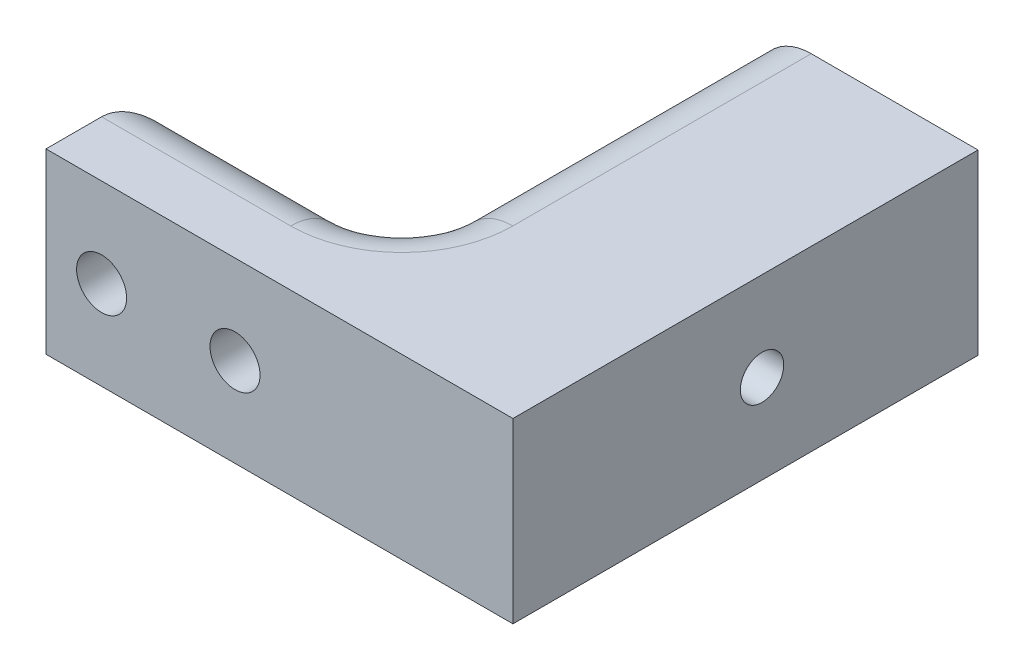
ISO-10303-21;
HEADER;
FILE_DESCRIPTION(('STEP AP214'),'2;1');
FILE_NAME('part.step','',(''),(''),'','','');
FILE_SCHEMA(('AUTOMOTIVE_DESIGN { 1 0 10303 214 1 1 1 1 }'));
ENDSEC;
DATA;
#1=APPLICATION_CONTEXT('core data for automotive mechanical design processes');
#2=APPLICATION_PROTOCOL_DEFINITION('international standard','automotive_design',2000,#1);
#3=PRODUCT_CONTEXT('',#1,'mechanical');
#4=PRODUCT('Part','Part','',(#3));
#5=PRODUCT_RELATED_PRODUCT_CATEGORY('part','',(#4));
#6=PRODUCT_DEFINITION_FORMATION('','',#4);
#7=PRODUCT_DEFINITION_CONTEXT('part definition',#1,'design');
#8=PRODUCT_DEFINITION('design','',#6,#7);
#9=PRODUCT_DEFINITION_SHAPE('','',#8);
#10=(LENGTH_UNIT() NAMED_UNIT(*) SI_UNIT(.MILLI.,.METRE.));
#11=(NAMED_UNIT(*) PLANE_ANGLE_UNIT() SI_UNIT($,.RADIAN.));
#12=(NAMED_UNIT(*) SI_UNIT($,.STERADIAN.) SOLID_ANGLE_UNIT());
#13=UNCERTAINTY_MEASURE_WITH_UNIT(LENGTH_MEASURE(1.E-05),#10,'distance_accuracy_value','');
#14=(GEOMETRIC_REPRESENTATION_CONTEXT(3) GLOBAL_UNCERTAINTY_ASSIGNED_CONTEXT((#13)) GLOBAL_UNIT_ASSIGNED_CONTEXT((#10,
#11,#12)) REPRESENTATION_CONTEXT('',''));
#15=CARTESIAN_POINT('',(0.,0.,0.));
#16=DIRECTION('',(0.,0.,1.));
#17=DIRECTION('',(1.,0.,0.));
#18=AXIS2_PLACEMENT_3D('',#15,#16,#17);
#19=CARTESIAN_POINT('',(0.999999999999994,8.,0.));
#20=DIRECTION('',(1.,0.,0.));
#21=DIRECTION('',(0.,0.,-1.));
#22=AXIS2_PLACEMENT_3D('',#19,#20,#21);
#23=PLANE('',#22);
#24=DIRECTION('',(0.,-0.866025403784438,0.5));
#25=VECTOR('',#24,1.);
#26=CARTESIAN_POINT('',(0.999999999999994,4.05,21.763268590218));
#27=LINE('',#26,#25);
#28=CARTESIAN_POINT('',(0.999999999999994,3.,22.3694863728671));
#29=VERTEX_POINT('',#28);
#30=CARTESIAN_POINT('',(0.999999999999994,0.,24.101537180436));
#31=VERTEX_POINT('',#30);
#32=EDGE_CURVE('E439',#29,#31,#27,.T.);
#33=ORIENTED_EDGE('',*,*,#32,.T.);
#34=DIRECTION('',(0.,-0.866025403784439,-0.5));
#35=VECTOR('',#34,1.);
#36=CARTESIAN_POINT('',(0.999999999999994,0.,24.101537180436));
#37=LINE('',#36,#35);
#38=CARTESIAN_POINT('',(0.999999999999994,-3.,22.3694863728671));
#39=VERTEX_POINT('',#38);
#40=EDGE_CURVE('E204',#31,#39,#37,.T.);
#41=ORIENTED_EDGE('',*,*,#40,.T.);
#42=DIRECTION('',(0.,0.,1.));
#43=VECTOR('',#42,1.);
#44=CARTESIAN_POINT('',(0.999999999999994,-3.,0.));
#45=LINE('',#44,#43);
#46=CARTESIAN_POINT('',(0.999999999999994,-3.,26.83));
#47=VERTEX_POINT('',#46);
#48=EDGE_CURVE('E270',#39,#47,#45,.T.);
#49=ORIENTED_EDGE('',*,*,#48,.T.);
#50=DIRECTION('',(0.,-1.,0.));
#51=VECTOR('',#50,1.);
#52=CARTESIAN_POINT('',(0.999999999999994,8.,26.83));
#53=LINE('',#52,#51);
#54=CARTESIAN_POINT('',(0.999999999999994,3.,26.83));
#55=VERTEX_POINT('',#54);
#56=EDGE_CURVE('E268',#47,#55,#53,.F.);
#57=ORIENTED_EDGE('',*,*,#56,.T.);
#58=DIRECTION('',(0.,0.,1.));
#59=VECTOR('',#58,1.);
#60=CARTESIAN_POINT('',(0.999999999999994,3.,0.));
#61=LINE('',#60,#59);
#62=EDGE_CURVE('E275',#55,#29,#61,.F.);
#63=ORIENTED_EDGE('',*,*,#62,.T.);
#64=EDGE_LOOP('',(#33,#41,#49,#57,#63));
#65=FACE_BOUND('',#64,.T.);
#66=ADVANCED_FACE('F39',(#65),#23,.F.);
#67=DIRECTION('',(0.,0.866025403784439,-0.5));
#68=VECTOR('',#67,1.);
#69=CARTESIAN_POINT('',(0.999999999999994,-4.05,17.086731409782));
#70=LINE('',#69,#68);
#71=CARTESIAN_POINT('',(0.999999999999994,-3.,16.4805136271329));
#72=VERTEX_POINT('',#71);
#73=CARTESIAN_POINT('',(0.999999999999994,0.,14.748462819564));
#74=VERTEX_POINT('',#73);
#75=EDGE_CURVE('E493',#72,#74,#70,.T.);
#76=ORIENTED_EDGE('',*,*,#75,.T.);
#77=DIRECTION('',(0.,0.866025403784439,0.499999999999999));
#78=VECTOR('',#77,1.);
#79=CARTESIAN_POINT('',(0.999999999999994,0.,14.748462819564));
#80=LINE('',#79,#78);
#81=CARTESIAN_POINT('',(0.999999999999994,3.,16.4805136271329));
#82=VERTEX_POINT('',#81);
#83=EDGE_CURVE('E200',#74,#82,#80,.T.);
#84=ORIENTED_EDGE('',*,*,#83,.T.);
#85=CARTESIAN_POINT('',(0.999999999999994,3.,0.));
#86=VERTEX_POINT('',#85);
#87=EDGE_CURVE('E274',#82,#86,#61,.F.);
#88=ORIENTED_EDGE('',*,*,#87,.T.);
#89=DIRECTION('',(0.,-1.,0.));
#90=VECTOR('',#89,1.);
#91=CARTESIAN_POINT('',(0.999999999999994,8.,0.));
#92=LINE('',#91,#90);
#93=CARTESIAN_POINT('',(0.999999999999994,-3.,0.));
#94=VERTEX_POINT('',#93);
#95=EDGE_CURVE('E228',#86,#94,#92,.T.);
#96=ORIENTED_EDGE('',*,*,#95,.T.);
#97=EDGE_CURVE('E271',#94,#72,#45,.T.);
#98=ORIENTED_EDGE('',*,*,#97,.T.);
#99=EDGE_LOOP('',(#76,#84,#88,#96,#98));
#100=FACE_BOUND('',#99,.T.);
#101=ADVANCED_FACE('F364',(#100),#23,.F.);
#102=CARTESIAN_POINT('',(5.99999999999999,-3.,0.));
#103=DIRECTION('',(0.,0.,1.));
#104=DIRECTION('',(1.,0.,0.));
#105=AXIS2_PLACEMENT_3D('',#102,#103,#104);
#106=CYLINDRICAL_SURFACE('',#105,5.);
#107=ORIENTED_EDGE('',*,*,#48,.F.);
#108=CARTESIAN_POINT('',(5.99999999999999,-3.,22.3694863728671));
#109=DIRECTION('',(0.,0.5,-0.866025403784439));
#110=DIRECTION('',(0.,0.866025403784439,0.5));
#111=AXIS2_PLACEMENT_3D('',#108,#109,#110);
#112=ELLIPSE('',#111,5.77350269189626,5.);
#113=CARTESIAN_POINT('',(1.11149307047642,-4.05,21.763268590218));
#114=VERTEX_POINT('',#113);
#115=EDGE_CURVE('E11',#39,#114,#112,.F.);
#116=ORIENTED_EDGE('',*,*,#115,.T.);
#117=DIRECTION('',(0.,0.,1.));
#118=VECTOR('',#117,1.);
#119=CARTESIAN_POINT('',(1.11149307047642,-4.05000000000001,0.));
#120=LINE('',#119,#118);
#121=CARTESIAN_POINT('',(1.11149307047642,-4.05,17.086731409782));
#122=VERTEX_POINT('',#121);
#123=EDGE_CURVE('E47',#114,#122,#120,.F.);
#124=ORIENTED_EDGE('',*,*,#123,.T.);
#125=CARTESIAN_POINT('',(5.99999999999999,-3.,16.4805136271329));
#126=DIRECTION('',(0.,0.5,0.866025403784439));
#127=DIRECTION('',(0.,-0.866025403784439,0.5));
#128=AXIS2_PLACEMENT_3D('',#125,#126,#127);
#129=ELLIPSE('',#128,5.77350269189626,5.);
#130=EDGE_CURVE('E457',#122,#72,#129,.F.);
#131=ORIENTED_EDGE('',*,*,#130,.T.);
#132=ORIENTED_EDGE('',*,*,#97,.F.);
#133=CARTESIAN_POINT('',(5.99999999999999,-3.,0.));
#134=DIRECTION('',(0.,0.,1.));
#135=DIRECTION('',(1.,0.,0.));
#136=AXIS2_PLACEMENT_3D('',#133,#134,#135);
#137=CIRCLE('',#136,5.);
#138=CARTESIAN_POINT('',(5.99999999999999,-8.,0.));
#139=VERTEX_POINT('',#138);
#140=EDGE_CURVE('E278',#139,#94,#137,.F.);
#141=ORIENTED_EDGE('',*,*,#140,.F.);
#142=DIRECTION('',(0.,0.,1.));
#143=VECTOR('',#142,1.);
#144=CARTESIAN_POINT('',(5.99999999999999,-8.,41.83));
#145=LINE('',#144,#143);
#146=CARTESIAN_POINT('',(5.99999999999999,-8.,26.83));
#147=VERTEX_POINT('',#146);
#148=EDGE_CURVE('E287',#147,#139,#145,.F.);
#149=ORIENTED_EDGE('',*,*,#148,.F.);
#150=CARTESIAN_POINT('',(5.99999999999999,-3.,26.83));
#151=DIRECTION('',(0.,0.,1.));
#152=DIRECTION('',(1.,0.,0.));
#153=AXIS2_PLACEMENT_3D('',#150,#151,#152);
#154=CIRCLE('',#153,5.);
#155=EDGE_CURVE('E317',#47,#147,#154,.T.);
#156=ORIENTED_EDGE('',*,*,#155,.F.);
#157=EDGE_LOOP('',(#107,#116,#124,#131,#132,#141,#149,#156));
#158=FACE_BOUND('',#157,.T.);
#159=ADVANCED_FACE('F391',(#158),#106,.T.);
#160=CARTESIAN_POINT('',(5.99999999999999,3.,41.83));
#161=DIRECTION('',(0.,0.,1.));
#162=DIRECTION('',(1.,0.,0.));
#163=AXIS2_PLACEMENT_3D('',#160,#161,#162);
#164=CYLINDRICAL_SURFACE('',#163,5.);
#165=DIRECTION('',(0.,0.,1.));
#166=VECTOR('',#165,1.);
#167=CARTESIAN_POINT('',(1.11149307047642,4.05,41.83));
#168=LINE('',#167,#166);
#169=CARTESIAN_POINT('',(1.11149307047642,4.05,17.086731409782));
#170=VERTEX_POINT('',#169);
#171=CARTESIAN_POINT('',(1.11149307047642,4.05,21.763268590218));
#172=VERTEX_POINT('',#171);
#173=EDGE_CURVE('E445',#170,#172,#168,.T.);
#174=ORIENTED_EDGE('',*,*,#173,.T.);
#175=CARTESIAN_POINT('',(5.99999999999999,3.,22.3694863728671));
#176=DIRECTION('',(0.,-0.5,-0.866025403784439));
#177=DIRECTION('',(0.,-0.866025403784438,0.5));
#178=AXIS2_PLACEMENT_3D('',#175,#176,#177);
#179=ELLIPSE('',#178,5.77350269189626,5.);
#180=EDGE_CURVE('E438',#172,#29,#179,.F.);
#181=ORIENTED_EDGE('',*,*,#180,.T.);
#182=ORIENTED_EDGE('',*,*,#62,.F.);
#183=CARTESIAN_POINT('',(5.99999999999999,3.,26.83));
#184=DIRECTION('',(0.,0.,1.));
#185=DIRECTION('',(1.,0.,0.));
#186=AXIS2_PLACEMENT_3D('',#183,#184,#185);
#187=CIRCLE('',#186,5.);
#188=CARTESIAN_POINT('',(5.99999999999999,8.,26.83));
#189=VERTEX_POINT('',#188);
#190=EDGE_CURVE('E227',#55,#189,#187,.F.);
#191=ORIENTED_EDGE('',*,*,#190,.T.);
#192=DIRECTION('',(0.,0.,1.));
#193=VECTOR('',#192,1.);
#194=CARTESIAN_POINT('',(5.99999999999999,8.,41.83));
#195=LINE('',#194,#193);
#196=CARTESIAN_POINT('',(5.99999999999999,8.,0.));
#197=VERTEX_POINT('',#196);
#198=EDGE_CURVE('E265',#197,#189,#195,.T.);
#199=ORIENTED_EDGE('',*,*,#198,.F.);
#200=CARTESIAN_POINT('',(5.99999999999999,3.,0.));
#201=DIRECTION('',(0.,0.,1.));
#202=DIRECTION('',(1.,0.,0.));
#203=AXIS2_PLACEMENT_3D('',#200,#201,#202);
#204=CIRCLE('',#203,5.);
#205=EDGE_CURVE('E280',#86,#197,#204,.F.);
#206=ORIENTED_EDGE('',*,*,#205,.F.);
#207=ORIENTED_EDGE('',*,*,#87,.F.);
#208=CARTESIAN_POINT('',(5.99999999999999,3.,16.4805136271329));
#209=DIRECTION('',(0.,-0.5,0.866025403784439));
#210=DIRECTION('',(0.,0.866025403784439,0.499999999999999));
#211=AXIS2_PLACEMENT_3D('',#208,#209,#210);
#212=ELLIPSE('',#211,5.77350269189625,5.);
#213=EDGE_CURVE('E462',#82,#170,#212,.F.);
#214=ORIENTED_EDGE('',*,*,#213,.T.);
#215=EDGE_LOOP('',(#174,#181,#182,#191,#199,#206,#207,#214));
#216=FACE_BOUND('',#215,.T.);
#217=ADVANCED_FACE('F388',(#216),#164,.T.);
#218=CARTESIAN_POINT('',(-21.,8.,41.83));
#219=DIRECTION('',(1.,0.,0.));
#220=DIRECTION('',(0.,1.,0.));
#221=AXIS2_PLACEMENT_3D('',#218,#219,#220);
#222=PLANE('',#221);
#223=DIRECTION('',(0.,0.,-1.));
#224=VECTOR('',#223,1.);
#225=CARTESIAN_POINT('',(-21.,8.,41.83));
#226=LINE('',#225,#224);
#227=CARTESIAN_POINT('',(-21.,8.,41.83));
#228=VERTEX_POINT('',#227);
#229=CARTESIAN_POINT('',(-21.,8.,36.83));
#230=VERTEX_POINT('',#229);
#231=EDGE_CURVE('E243',#228,#230,#226,.T.);
#232=ORIENTED_EDGE('',*,*,#231,.T.);
#233=DIRECTION('',(0.,-1.,0.));
#234=VECTOR('',#233,1.);
#235=CARTESIAN_POINT('',(-21.,8.,36.83));
#236=LINE('',#235,#234);
#237=CARTESIAN_POINT('',(-21.,-8.,36.83));
#238=VERTEX_POINT('',#237);
#239=EDGE_CURVE('E301',#230,#238,#236,.T.);
#240=ORIENTED_EDGE('',*,*,#239,.T.);
#241=DIRECTION('',(0.,0.,-1.));
#242=VECTOR('',#241,1.);
#243=CARTESIAN_POINT('',(-21.,-8.,41.83));
#244=LINE('',#243,#242);
#245=CARTESIAN_POINT('',(-21.,-8.,41.83));
#246=VERTEX_POINT('',#245);
#247=EDGE_CURVE('E257',#246,#238,#244,.T.);
#248=ORIENTED_EDGE('',*,*,#247,.F.);
#249=DIRECTION('',(0.,-1.,0.));
#250=VECTOR('',#249,1.);
#251=CARTESIAN_POINT('',(-21.,8.,41.83));
#252=LINE('',#251,#250);
#253=EDGE_CURVE('E233',#228,#246,#252,.T.);
#254=ORIENTED_EDGE('',*,*,#253,.F.);
#255=EDGE_LOOP('',(#232,#240,#248,#254));
#256=FACE_BOUND('',#255,.T.);
#257=ADVANCED_FACE('F384',(#256),#222,.F.);
#258=CARTESIAN_POINT('',(-21.,-8.,41.83));
#259=DIRECTION('',(0.,1.,0.));
#260=DIRECTION('',(0.,0.,1.));
#261=AXIS2_PLACEMENT_3D('',#258,#259,#260);
#262=PLANE('',#261);
#263=CARTESIAN_POINT('',(-4.00000000000001,-8.,26.83));
#264=DIRECTION('',(0.,1.,0.));
#265=DIRECTION('',(0.,0.,1.));
#266=AXIS2_PLACEMENT_3D('',#263,#264,#265);
#267=CIRCLE('',#266,10.);
#268=CARTESIAN_POINT('',(-4.00000000000001,-8.,36.83));
#269=VERTEX_POINT('',#268);
#270=EDGE_CURVE('E282',#147,#269,#267,.F.);
#271=ORIENTED_EDGE('',*,*,#270,.F.);
#272=ORIENTED_EDGE('',*,*,#148,.T.);
#273=DIRECTION('',(1.,0.,0.));
#274=VECTOR('',#273,1.);
#275=CARTESIAN_POINT('',(-21.,-8.,0.));
#276=LINE('',#275,#274);
#277=CARTESIAN_POINT('',(21.,-8.,0.));
#278=VERTEX_POINT('',#277);
#279=EDGE_CURVE('E231',#139,#278,#276,.T.);
#280=ORIENTED_EDGE('',*,*,#279,.T.);
#281=DIRECTION('',(0.,0.,-1.));
#282=VECTOR('',#281,1.);
#283=CARTESIAN_POINT('',(21.,-8.,41.83));
#284=LINE('',#283,#282);
#285=CARTESIAN_POINT('',(21.,-8.,41.83));
#286=VERTEX_POINT('',#285);
#287=EDGE_CURVE('E254',#286,#278,#284,.T.);
#288=ORIENTED_EDGE('',*,*,#287,.F.);
#289=DIRECTION('',(1.,0.,0.));
#290=VECTOR('',#289,1.);
#291=CARTESIAN_POINT('',(-21.,-8.,41.83));
#292=LINE('',#291,#290);
#293=EDGE_CURVE('E236',#246,#286,#292,.T.);
#294=ORIENTED_EDGE('',*,*,#293,.F.);
#295=ORIENTED_EDGE('',*,*,#247,.T.);
#296=DIRECTION('',(-1.,0.,0.));
#297=VECTOR('',#296,1.);
#298=CARTESIAN_POINT('',(-21.,-8.,36.83));
#299=LINE('',#298,#297);
#300=EDGE_CURVE('E285',#238,#269,#299,.F.);
#301=ORIENTED_EDGE('',*,*,#300,.T.);
#302=EDGE_LOOP('',(#271,#272,#280,#288,#294,#295,#301));
#303=FACE_BOUND('',#302,.T.);
#304=ADVANCED_FACE('F380',(#303),#262,.F.);
#305=CARTESIAN_POINT('',(21.,8.,41.83));
#306=DIRECTION('',(-1.,0.,0.));
#307=DIRECTION('',(0.,-1.,0.));
#308=AXIS2_PLACEMENT_3D('',#305,#306,#307);
#309=PLANE('',#308);
#310=CARTESIAN_POINT('',(21.,0.,19.425));
#311=DIRECTION('',(1.,0.,0.));
#312=DIRECTION('',(0.,0.,-1.));
#313=AXIS2_PLACEMENT_3D('',#310,#311,#312);
#314=CIRCLE('',#313,1.94999999999999);
#315=CARTESIAN_POINT('',(21.,0.,17.475));
#316=VERTEX_POINT('',#315);
#317=EDGE_CURVE('E224',#316,#316,#314,.T.);
#318=ORIENTED_EDGE('',*,*,#317,.F.);
#319=EDGE_LOOP('',(#318));
#320=FACE_BOUND('',#319,.T.);
#321=DIRECTION('',(0.,1.,0.));
#322=VECTOR('',#321,1.);
#323=CARTESIAN_POINT('',(21.,8.,0.));
#324=LINE('',#323,#322);
#325=CARTESIAN_POINT('',(21.,8.,0.));
#326=VERTEX_POINT('',#325);
#327=EDGE_CURVE('E245',#278,#326,#324,.T.);
#328=ORIENTED_EDGE('',*,*,#327,.T.);
#329=DIRECTION('',(0.,0.,-1.));
#330=VECTOR('',#329,1.);
#331=CARTESIAN_POINT('',(21.,8.,41.83));
#332=LINE('',#331,#330);
#333=CARTESIAN_POINT('',(21.,8.,41.83));
#334=VERTEX_POINT('',#333);
#335=EDGE_CURVE('E251',#334,#326,#332,.T.);
#336=ORIENTED_EDGE('',*,*,#335,.F.);
#337=DIRECTION('',(0.,1.,0.));
#338=VECTOR('',#337,1.);
#339=CARTESIAN_POINT('',(21.,8.,41.83));
#340=LINE('',#339,#338);
#341=EDGE_CURVE('E239',#286,#334,#340,.T.);
#342=ORIENTED_EDGE('',*,*,#341,.F.);
#343=ORIENTED_EDGE('',*,*,#287,.T.);
#344=EDGE_LOOP('',(#328,#336,#342,#343));
#345=FACE_BOUND('',#344,.T.);
#346=ADVANCED_FACE('F376',(#320,#345),#309,.F.);
#347=CARTESIAN_POINT('',(-21.,8.,41.83));
#348=DIRECTION('',(0.,-1.,0.));
#349=DIRECTION('',(0.,0.,-1.));
#350=AXIS2_PLACEMENT_3D('',#347,#348,#349);
#351=PLANE('',#350);
#352=DIRECTION('',(-1.,0.,0.));
#353=VECTOR('',#352,1.);
#354=CARTESIAN_POINT('',(-21.,8.,0.));
#355=LINE('',#354,#353);
#356=EDGE_CURVE('E237',#326,#197,#355,.T.);
#357=ORIENTED_EDGE('',*,*,#356,.T.);
#358=ORIENTED_EDGE('',*,*,#198,.T.);
#359=CARTESIAN_POINT('',(-4.00000000000001,8.,26.83));
#360=DIRECTION('',(0.,-1.,0.));
#361=DIRECTION('',(0.,0.,-1.));
#362=AXIS2_PLACEMENT_3D('',#359,#360,#361);
#363=CIRCLE('',#362,10.);
#364=CARTESIAN_POINT('',(-4.00000000000001,8.,36.83));
#365=VERTEX_POINT('',#364);
#366=EDGE_CURVE('E262',#365,#189,#363,.F.);
#367=ORIENTED_EDGE('',*,*,#366,.F.);
#368=DIRECTION('',(-1.,0.,0.));
#369=VECTOR('',#368,1.);
#370=CARTESIAN_POINT('',(-21.,8.,36.83));
#371=LINE('',#370,#369);
#372=EDGE_CURVE('E260',#365,#230,#371,.T.);
#373=ORIENTED_EDGE('',*,*,#372,.T.);
#374=ORIENTED_EDGE('',*,*,#231,.F.);
#375=DIRECTION('',(-1.,0.,0.));
#376=VECTOR('',#375,1.);
#377=CARTESIAN_POINT('',(-21.,8.,41.83));
#378=LINE('',#377,#376);
#379=EDGE_CURVE('E241',#334,#228,#378,.T.);
#380=ORIENTED_EDGE('',*,*,#379,.F.);
#381=ORIENTED_EDGE('',*,*,#335,.T.);
#382=EDGE_LOOP('',(#357,#358,#367,#373,#374,#380,#381));
#383=FACE_BOUND('',#382,.T.);
#384=ADVANCED_FACE('F369',(#383),#351,.F.);
#385=CARTESIAN_POINT('',(0.,0.,41.83));
#386=DIRECTION('',(0.,0.,1.));
#387=DIRECTION('',(1.,0.,0.));
#388=AXIS2_PLACEMENT_3D('',#385,#386,#387);
#389=PLANE('',#388);
#390=CARTESIAN_POINT('',(-16.,0.,41.83));
#391=DIRECTION('',(0.,0.,1.));
#392=DIRECTION('',(1.,0.,0.));
#393=AXIS2_PLACEMENT_3D('',#390,#391,#392);
#394=CIRCLE('',#393,2.24999999999999);
#395=CARTESIAN_POINT('',(-13.75,0.,41.83));
#396=VERTEX_POINT('',#395);
#397=EDGE_CURVE('E209',#396,#396,#394,.T.);
#398=ORIENTED_EDGE('',*,*,#397,.F.);
#399=EDGE_LOOP('',(#398));
#400=FACE_BOUND('',#399,.T.);
#401=CARTESIAN_POINT('',(-4.00000000000001,0.,41.83));
#402=DIRECTION('',(0.,0.,1.));
#403=DIRECTION('',(1.,0.,0.));
#404=AXIS2_PLACEMENT_3D('',#401,#402,#403);
#405=CIRCLE('',#404,2.24999999999999);
#406=CARTESIAN_POINT('',(-1.75000000000002,0.,41.83));
#407=VERTEX_POINT('',#406);
#408=EDGE_CURVE('E218',#407,#407,#405,.T.);
#409=ORIENTED_EDGE('',*,*,#408,.F.);
#410=EDGE_LOOP('',(#409));
#411=FACE_BOUND('',#410,.T.);
#412=ORIENTED_EDGE('',*,*,#253,.T.);
#413=ORIENTED_EDGE('',*,*,#293,.T.);
#414=ORIENTED_EDGE('',*,*,#341,.T.);
#415=ORIENTED_EDGE('',*,*,#379,.T.);
#416=EDGE_LOOP('',(#412,#413,#414,#415));
#417=FACE_BOUND('',#416,.T.);
#418=ADVANCED_FACE('F366',(#400,#411,#417),#389,.T.);
#419=CARTESIAN_POINT('',(0.,0.,0.));
#420=DIRECTION('',(0.,0.,1.));
#421=DIRECTION('',(1.,0.,0.));
#422=AXIS2_PLACEMENT_3D('',#419,#420,#421);
#423=PLANE('',#422);
#424=ORIENTED_EDGE('',*,*,#95,.F.);
#425=ORIENTED_EDGE('',*,*,#205,.T.);
#426=ORIENTED_EDGE('',*,*,#356,.F.);
#427=ORIENTED_EDGE('',*,*,#327,.F.);
#428=ORIENTED_EDGE('',*,*,#279,.F.);
#429=ORIENTED_EDGE('',*,*,#140,.T.);
#430=EDGE_LOOP('',(#424,#425,#426,#427,#428,#429));
#431=FACE_BOUND('',#430,.T.);
#432=ADVANCED_FACE('F360',(#431),#423,.F.);
#433=CARTESIAN_POINT('',(-21.,8.,31.83));
#434=DIRECTION('',(0.,0.,1.));
#435=DIRECTION('',(1.,0.,0.));
#436=AXIS2_PLACEMENT_3D('',#433,#434,#435);
#437=PLANE('',#436);
#438=DIRECTION('',(0.,-1.,0.));
#439=VECTOR('',#438,1.);
#440=CARTESIAN_POINT('',(-16.,8.,31.83));
#441=LINE('',#440,#439);
#442=CARTESIAN_POINT('',(-16.,-3.,31.83));
#443=VERTEX_POINT('',#442);
#444=CARTESIAN_POINT('',(-16.,-2.24999999999999,31.83));
#445=VERTEX_POINT('',#444);
#446=EDGE_CURVE('E290',#443,#445,#441,.F.);
#447=ORIENTED_EDGE('',*,*,#446,.T.);
#448=CARTESIAN_POINT('',(-16.,0.,31.83));
#449=DIRECTION('',(0.,0.,1.));
#450=DIRECTION('',(1.,0.,0.));
#451=AXIS2_PLACEMENT_3D('',#448,#449,#450);
#452=CIRCLE('',#451,2.24999999999999);
#453=CARTESIAN_POINT('',(-16.,2.24999999999999,31.83));
#454=VERTEX_POINT('',#453);
#455=EDGE_CURVE('E61',#445,#454,#452,.T.);
#456=ORIENTED_EDGE('',*,*,#455,.T.);
#457=CARTESIAN_POINT('',(-16.,3.,31.83));
#458=VERTEX_POINT('',#457);
#459=EDGE_CURVE('E289',#454,#458,#441,.F.);
#460=ORIENTED_EDGE('',*,*,#459,.T.);
#461=DIRECTION('',(-1.,0.,0.));
#462=VECTOR('',#461,1.);
#463=CARTESIAN_POINT('',(-21.,3.,31.83));
#464=LINE('',#463,#462);
#465=CARTESIAN_POINT('',(-4.00000000000001,3.,31.83));
#466=VERTEX_POINT('',#465);
#467=EDGE_CURVE('E293',#458,#466,#464,.F.);
#468=ORIENTED_EDGE('',*,*,#467,.T.);
#469=DIRECTION('',(0.,-1.,0.));
#470=VECTOR('',#469,1.);
#471=CARTESIAN_POINT('',(-4.00000000000001,-8.,31.83));
#472=LINE('',#471,#470);
#473=CARTESIAN_POINT('',(-4.00000000000001,2.24999999999999,31.83));
#474=VERTEX_POINT('',#473);
#475=EDGE_CURVE('E298',#466,#474,#472,.T.);
#476=ORIENTED_EDGE('',*,*,#475,.T.);
#477=CARTESIAN_POINT('',(-4.00000000000001,0.,31.83));
#478=DIRECTION('',(0.,0.,1.));
#479=DIRECTION('',(1.,0.,0.));
#480=AXIS2_PLACEMENT_3D('',#477,#478,#479);
#481=CIRCLE('',#480,2.24999999999999);
#482=CARTESIAN_POINT('',(-4.00000000000001,-2.24999999999999,31.83));
#483=VERTEX_POINT('',#482);
#484=EDGE_CURVE('E221',#474,#483,#481,.T.);
#485=ORIENTED_EDGE('',*,*,#484,.T.);
#486=CARTESIAN_POINT('',(-4.00000000000001,-3.,31.83));
#487=VERTEX_POINT('',#486);
#488=EDGE_CURVE('E297',#483,#487,#472,.T.);
#489=ORIENTED_EDGE('',*,*,#488,.T.);
#490=DIRECTION('',(-1.,0.,0.));
#491=VECTOR('',#490,1.);
#492=CARTESIAN_POINT('',(-21.,-3.,31.83));
#493=LINE('',#492,#491);
#494=EDGE_CURVE('E295',#487,#443,#493,.T.);
#495=ORIENTED_EDGE('',*,*,#494,.T.);
#496=EDGE_LOOP('',(#447,#456,#460,#468,#476,#485,#489,#495));
#497=FACE_BOUND('',#496,.T.);
#498=ADVANCED_FACE('F357',(#497),#437,.F.);
#499=CARTESIAN_POINT('',(-21.,-3.,36.83));
#500=DIRECTION('',(-1.,0.,0.));
#501=DIRECTION('',(0.,0.,1.));
#502=AXIS2_PLACEMENT_3D('',#499,#500,#501);
#503=CYLINDRICAL_SURFACE('',#502,5.);
#504=CARTESIAN_POINT('',(-4.00000000000001,-3.,36.83));
#505=DIRECTION('',(1.,0.,0.));
#506=DIRECTION('',(0.,0.,-1.));
#507=AXIS2_PLACEMENT_3D('',#504,#505,#506);
#508=CIRCLE('',#507,5.);
#509=EDGE_CURVE('E320',#269,#487,#508,.T.);
#510=ORIENTED_EDGE('',*,*,#509,.F.);
#511=ORIENTED_EDGE('',*,*,#300,.F.);
#512=CARTESIAN_POINT('',(-16.,-3.,36.83));
#513=DIRECTION('',(0.707106781186548,-0.707106781186547,0.));
#514=DIRECTION('',(-0.707106781186547,-0.707106781186548,0.));
#515=AXIS2_PLACEMENT_3D('',#512,#513,#514);
#516=ELLIPSE('',#515,7.07106781186547,5.);
#517=EDGE_CURVE('E232',#443,#238,#516,.F.);
#518=ORIENTED_EDGE('',*,*,#517,.F.);
#519=ORIENTED_EDGE('',*,*,#494,.F.);
#520=EDGE_LOOP('',(#510,#511,#518,#519));
#521=FACE_BOUND('',#520,.T.);
#522=ADVANCED_FACE('F41',(#521),#503,.T.);
#523=CARTESIAN_POINT('',(-16.,8.,36.83));
#524=DIRECTION('',(0.,-1.,0.));
#525=DIRECTION('',(1.,0.,0.));
#526=AXIS2_PLACEMENT_3D('',#523,#524,#525);
#527=CYLINDRICAL_SURFACE('',#526,5.);
#528=CARTESIAN_POINT('',(-16.,-2.24999999999999,31.83));
#529=CARTESIAN_POINT('',(-16.0600900595736,-2.25000903332351,31.8299901468764));
#530=CARTESIAN_POINT('',(-16.1201739102406,-2.24759302530098,31.8310829920901));
#531=CARTESIAN_POINT('',(-16.2398605814315,-2.23798109320971,31.8354003504277));
#532=CARTESIAN_POINT('',(-16.2994635623207,-2.23078683549092,31.8386241204186));
#533=CARTESIAN_POINT('',(-16.4175272101719,-2.21172644949992,31.8471127850977));
#534=CARTESIAN_POINT('',(-16.4759914768106,-2.19987901084497,31.8523695130797));
#535=CARTESIAN_POINT('',(-16.5915947902772,-2.17164927601584,31.8647808167756));
#536=CARTESIAN_POINT('',(-16.6487337693729,-2.15526674861494,31.8719354892576));
#537=CARTESIAN_POINT('',(-16.8174731966093,-2.09957772498573,31.8959766321145));
#538=CARTESIAN_POINT('',(-16.9266152168454,-2.05369383797357,31.9154569559092));
#539=CARTESIAN_POINT('',(-17.1355912738076,-1.9459692050054,31.9594878846069));
#540=CARTESIAN_POINT('',(-17.2354171239901,-1.88411460130133,31.984042889085));
#541=CARTESIAN_POINT('',(-17.4286421831921,-1.74256748883521,32.037346611615));
#542=CARTESIAN_POINT('',(-17.5214496077984,-1.66212310045044,32.0662457843942));
#543=CARTESIAN_POINT('',(-17.6927712585116,-1.48728704060532,32.1243939274503));
#544=CARTESIAN_POINT('',(-17.7712783090581,-1.39288841006301,32.1536430655298));
#545=CARTESIAN_POINT('',(-17.9164422729077,-1.18602014345573,32.2111572006062));
#546=CARTESIAN_POINT('',(-17.9821135785693,-1.07280864349494,32.2392595461251));
#547=CARTESIAN_POINT('',(-18.0932143655816,-0.835515799046078,32.2888347318364));
#548=CARTESIAN_POINT('',(-18.1386563816831,-0.711441242876345,32.3103116748116));
#549=CARTESIAN_POINT('',(-18.2054418259751,-0.462808113032463,32.3425348882755));
#550=CARTESIAN_POINT('',(-18.2279435286375,-0.338629899265447,32.3537933681081));
#551=CARTESIAN_POINT('',(-18.2518073954852,-0.0877873736172454,32.3657462617013));
#552=CARTESIAN_POINT('',(-18.2531837718157,0.0388752094507018,32.3664477776942));
#553=CARTESIAN_POINT('',(-18.2356190597342,0.278583064263588,32.3576328251588));
#554=CARTESIAN_POINT('',(-18.218540425298,0.391806684363279,32.3490529358715));
#555=CARTESIAN_POINT('',(-18.1677141910923,0.613564114133187,32.3242474213209));
#556=CARTESIAN_POINT('',(-18.13396304675,0.722096921199107,32.3080201702635));
#557=CARTESIAN_POINT('',(-18.0500818388845,0.934337593724171,32.2693717907739));
#558=CARTESIAN_POINT('',(-17.9995984111147,1.03788069331065,32.2468188074116));
#559=CARTESIAN_POINT('',(-17.8839394724294,1.23547223081563,32.1980776390803));
#560=CARTESIAN_POINT('',(-17.818757418626,1.32951641334787,32.1718878372331));
#561=CARTESIAN_POINT('',(-17.6679149064027,1.51534659375495,32.1156432915918));
#562=CARTESIAN_POINT('',(-17.5808578537227,1.60596470382814,32.0854640578124));
#563=CARTESIAN_POINT('',(-17.392528858894,1.77175219645388,32.0268151944198));
#564=CARTESIAN_POINT('',(-17.2912512451432,1.84691538548232,31.9983462534249));
#565=CARTESIAN_POINT('',(-17.0732726816606,1.98179746606398,31.9452224044265));
#566=CARTESIAN_POINT('',(-16.9561868305229,2.04095626489373,31.9207156135379));
#567=CARTESIAN_POINT('',(-16.7123949916641,2.1382583607198,31.8794753146217));
#568=CARTESIAN_POINT('',(-16.5857051458443,2.17643606800494,31.8627290859065));
#569=CARTESIAN_POINT('',(-16.3814991502392,2.21874217159694,31.8440063416139));
#570=CARTESIAN_POINT('',(-16.305770999491,2.23043983171598,31.8387794888865));
#571=CARTESIAN_POINT('',(-16.1533795981778,2.24607451822669,31.8317670368254));
#572=CARTESIAN_POINT('',(-16.0767165621219,2.25001329239305,31.829980662488));
#573=CARTESIAN_POINT('',(-16.,2.24999999999999,31.83));
#574=B_SPLINE_CURVE_WITH_KNOTS('',3,(#528,#529,#530,#531,#532,#533,#534,#535,#536,#537,#538,
#539,#540,#541,#542,#543,#544,#545,#546,#547,#548,#549,#550,#551,#552,#553,#554,#555,#556,#557,
#558,#559,#560,#561,#562,#563,#564,#565,#566,#567,#568,#569,#570,#571,#572,#573),.UNSPECIFIED.,
.F.,.F.,(4,2,2,2,2,2,2,2,2,2,2,2,2,2,2,2,2,2,2,2,2,2,4),(0.,0.180201315039399,0.360339820281145,
0.539762074676482,0.719193478806681,1.07739679132902,1.43591196657713,1.81280578352995,
2.18988819827903,2.58945307834577,2.98877002872761,3.36674289958803,3.74446147657811,
4.0873377569977,4.43028696425218,4.78099696975328,5.13186339816435,5.51784356589259,
5.90397811410505,6.30225708139878,6.69988088221125,6.92985997108585,7.15978724870629),.UNSPECIFIED.);
#575=EDGE_CURVE('E333',#445,#454,#574,.T.);
#576=ORIENTED_EDGE('',*,*,#575,.F.);
#577=ORIENTED_EDGE('',*,*,#446,.F.);
#578=ORIENTED_EDGE('',*,*,#517,.T.);
#579=ORIENTED_EDGE('',*,*,#239,.F.);
#580=CARTESIAN_POINT('',(-16.,3.,36.83));
#581=DIRECTION('',(-0.707106781186547,-0.707106781186548,0.));
#582=DIRECTION('',(0.707106781186548,-0.707106781186547,0.));
#583=AXIS2_PLACEMENT_3D('',#580,#581,#582);
#584=ELLIPSE('',#583,7.07106781186548,5.);
#585=EDGE_CURVE('E314',#458,#230,#584,.F.);
#586=ORIENTED_EDGE('',*,*,#585,.F.);
#587=ORIENTED_EDGE('',*,*,#459,.F.);
#588=EDGE_LOOP('',(#576,#577,#578,#579,#586,#587));
#589=FACE_BOUND('',#588,.T.);
#590=ADVANCED_FACE('F413',(#589),#527,.T.);
#591=CARTESIAN_POINT('',(-4.00000000000001,-3.,26.83));
#592=DIRECTION('',(0.,1.,0.));
#593=DIRECTION('',(0.,0.,1.));
#594=AXIS2_PLACEMENT_3D('',#591,#592,#593);
#595=TOROIDAL_SURFACE('',#594,10.,5.);
#596=ORIENTED_EDGE('',*,*,#270,.T.);
#597=ORIENTED_EDGE('',*,*,#509,.T.);
#598=CARTESIAN_POINT('',(-4.00000000000001,-3.,26.83));
#599=DIRECTION('',(0.,1.,0.));
#600=DIRECTION('',(0.,0.,1.));
#601=AXIS2_PLACEMENT_3D('',#598,#599,#600);
#602=CIRCLE('',#601,5.);
#603=EDGE_CURVE('E311',#47,#487,#602,.F.);
#604=ORIENTED_EDGE('',*,*,#603,.F.);
#605=ORIENTED_EDGE('',*,*,#155,.T.);
#606=EDGE_LOOP('',(#596,#597,#604,#605));
#607=FACE_BOUND('',#606,.T.);
#608=ADVANCED_FACE('F448',(#607),#595,.T.);
#609=CARTESIAN_POINT('',(-21.,3.,36.83));
#610=DIRECTION('',(-1.,0.,0.));
#611=DIRECTION('',(0.,0.,1.));
#612=AXIS2_PLACEMENT_3D('',#609,#610,#611);
#613=CYLINDRICAL_SURFACE('',#612,5.);
#614=ORIENTED_EDGE('',*,*,#585,.T.);
#615=ORIENTED_EDGE('',*,*,#372,.F.);
#616=CARTESIAN_POINT('',(-4.00000000000001,3.,36.83));
#617=DIRECTION('',(1.,0.,0.));
#618=DIRECTION('',(0.,0.,-1.));
#619=AXIS2_PLACEMENT_3D('',#616,#617,#618);
#620=CIRCLE('',#619,5.);
#621=EDGE_CURVE('E308',#466,#365,#620,.T.);
#622=ORIENTED_EDGE('',*,*,#621,.F.);
#623=ORIENTED_EDGE('',*,*,#467,.F.);
#624=EDGE_LOOP('',(#614,#615,#622,#623));
#625=FACE_BOUND('',#624,.T.);
#626=ADVANCED_FACE('F398',(#625),#613,.T.);
#627=CARTESIAN_POINT('',(-4.00000000000001,8.,26.83));
#628=DIRECTION('',(0.,1.,0.));
#629=DIRECTION('',(0.,0.,1.));
#630=AXIS2_PLACEMENT_3D('',#627,#628,#629);
#631=CYLINDRICAL_SURFACE('',#630,5.);
#632=ORIENTED_EDGE('',*,*,#488,.F.);
#633=CARTESIAN_POINT('',(-4.00000000000001,-2.24999999999999,31.83));
#634=CARTESIAN_POINT('',(-3.93990994042638,-2.25000903332351,31.8300098531236));
#635=CARTESIAN_POINT('',(-3.87982608975946,-2.24759302530098,31.8289170079099));
#636=CARTESIAN_POINT('',(-3.76013941856851,-2.23798109320971,31.8245996495723));
#637=CARTESIAN_POINT('',(-3.70053643767932,-2.23078683549092,31.8213758795814));
#638=CARTESIAN_POINT('',(-3.58247278982811,-2.21172644949992,31.8128872149023));
#639=CARTESIAN_POINT('',(-3.52400852318942,-2.19987901084497,31.8076304869203));
#640=CARTESIAN_POINT('',(-3.40840520972276,-2.17164927601583,31.7952191832244));
#641=CARTESIAN_POINT('',(-3.35126623062712,-2.15526674861494,31.7880645107424));
#642=CARTESIAN_POINT('',(-3.18252680339068,-2.09957772498573,31.7640233678855));
#643=CARTESIAN_POINT('',(-3.07338478315459,-2.05369383797357,31.7445430440907));
#644=CARTESIAN_POINT('',(-2.86440872619238,-1.9459692050054,31.7005121153931));
#645=CARTESIAN_POINT('',(-2.76458287600988,-1.88411460130132,31.675957110915));
#646=CARTESIAN_POINT('',(-2.57135781680795,-1.74256748883521,31.622653388385));
#647=CARTESIAN_POINT('',(-2.47855039220164,-1.66212310045044,31.5937542156058));
#648=CARTESIAN_POINT('',(-2.3072287414884,-1.48728704060532,31.5356060725497));
#649=CARTESIAN_POINT('',(-2.22872169094196,-1.39288841006301,31.5063569344702));
#650=CARTESIAN_POINT('',(-2.08355772709231,-1.18602014345573,31.4488427993938));
#651=CARTESIAN_POINT('',(-2.01788642143066,-1.07280864349494,31.4207404538749));
#652=CARTESIAN_POINT('',(-1.90678563441842,-0.835515799046078,31.3711652681636));
#653=CARTESIAN_POINT('',(-1.86134361831692,-0.711441242876346,31.3496883251884));
#654=CARTESIAN_POINT('',(-1.79455817402493,-0.462808113032464,31.3174651117245));
#655=CARTESIAN_POINT('',(-1.77205647136247,-0.338629899265448,31.3062066318919));
#656=CARTESIAN_POINT('',(-1.7481926045148,-0.0877873736172463,31.2942537382987));
#657=CARTESIAN_POINT('',(-1.7468162281843,0.038875209450701,31.2935522223058));
#658=CARTESIAN_POINT('',(-1.76438094026579,0.278583064263586,31.3023671748411));
#659=CARTESIAN_POINT('',(-1.78145957470203,0.391806684363277,31.3109470641285));
#660=CARTESIAN_POINT('',(-1.83228580890769,0.613564114133185,31.3357525786791));
#661=CARTESIAN_POINT('',(-1.86603695325004,0.722096921199106,31.3519798297365));
#662=CARTESIAN_POINT('',(-1.94991816111547,0.934337593724169,31.3906282092261));
#663=CARTESIAN_POINT('',(-2.00040158888535,1.03788069331065,31.4131811925884));
#664=CARTESIAN_POINT('',(-2.11606052757058,1.23547223081563,31.4619223609197));
#665=CARTESIAN_POINT('',(-2.18124258137397,1.32951641334787,31.4881121627669));
#666=CARTESIAN_POINT('',(-2.33208509359729,1.51534659375495,31.5443567084082));
#667=CARTESIAN_POINT('',(-2.41914214627736,1.60596470382813,31.5745359421876));
#668=CARTESIAN_POINT('',(-2.60747114110602,1.77175219645388,31.6331848055802));
#669=CARTESIAN_POINT('',(-2.70874875485679,1.84691538548232,31.661653746575));
#670=CARTESIAN_POINT('',(-2.92672731833939,1.98179746606398,31.7147775955735));
#671=CARTESIAN_POINT('',(-3.04381316947715,2.04095626489373,31.7392843864621));
#672=CARTESIAN_POINT('',(-3.28760500833589,2.1382583607198,31.7805246853783));
#673=CARTESIAN_POINT('',(-3.41429485415575,2.17643606800494,31.7972709140935));
#674=CARTESIAN_POINT('',(-3.61850084976081,2.21874217159694,31.8159936583861));
#675=CARTESIAN_POINT('',(-3.69422900050903,2.23043983171598,31.8212205111135));
#676=CARTESIAN_POINT('',(-3.84662040182225,2.2460745182267,31.8282329631746));
#677=CARTESIAN_POINT('',(-3.92328343787808,2.25001329239305,31.830019337512));
#678=CARTESIAN_POINT('',(-4.00000000000001,2.24999999999999,31.83));
#679=B_SPLINE_CURVE_WITH_KNOTS('',3,(#633,#634,#635,#636,#637,#638,#639,#640,#641,#642,#643,
#644,#645,#646,#647,#648,#649,#650,#651,#652,#653,#654,#655,#656,#657,#658,#659,#660,#661,#662,
#663,#664,#665,#666,#667,#668,#669,#670,#671,#672,#673,#674,#675,#676,#677,#678),.UNSPECIFIED.,
.F.,.F.,(4,2,2,2,2,2,2,2,2,2,2,2,2,2,2,2,2,2,2,2,2,2,4),(0.,0.180201315039396,0.360339820281144,
0.539762074676488,0.719193478806681,1.07739679132902,1.43591196657713,1.81280578352995,
2.18988819827903,2.58945307834576,2.98877002872761,3.36674289958803,3.74446147657811,
4.0873377569977,4.43028696425217,4.78099696975327,5.13186339816435,5.51784356589258,
5.90397811410505,6.30225708139878,6.69988088221125,6.92985997108584,7.15978724870629),.UNSPECIFIED.);
#680=EDGE_CURVE('E303',#483,#474,#679,.T.);
#681=ORIENTED_EDGE('',*,*,#680,.T.);
#682=ORIENTED_EDGE('',*,*,#475,.F.);
#683=CARTESIAN_POINT('',(-4.00000000000001,3.,26.83));
#684=DIRECTION('',(0.,-1.,0.));
#685=DIRECTION('',(0.,0.,-1.));
#686=AXIS2_PLACEMENT_3D('',#683,#684,#685);
#687=CIRCLE('',#686,5.);
#688=EDGE_CURVE('E305',#55,#466,#687,.T.);
#689=ORIENTED_EDGE('',*,*,#688,.F.);
#690=ORIENTED_EDGE('',*,*,#56,.F.);
#691=ORIENTED_EDGE('',*,*,#603,.T.);
#692=EDGE_LOOP('',(#632,#681,#682,#689,#690,#691));
#693=FACE_BOUND('',#692,.T.);
#694=ADVANCED_FACE('F340',(#693),#631,.F.);
#695=CARTESIAN_POINT('',(-4.00000000000001,3.,26.83));
#696=DIRECTION('',(0.,-1.,0.));
#697=DIRECTION('',(0.,0.,-1.));
#698=AXIS2_PLACEMENT_3D('',#695,#696,#697);
#699=TOROIDAL_SURFACE('',#698,10.,5.);
#700=ORIENTED_EDGE('',*,*,#621,.T.);
#701=ORIENTED_EDGE('',*,*,#366,.T.);
#702=ORIENTED_EDGE('',*,*,#190,.F.);
#703=ORIENTED_EDGE('',*,*,#688,.T.);
#704=EDGE_LOOP('',(#700,#701,#702,#703));
#705=FACE_BOUND('',#704,.T.);
#706=ADVANCED_FACE('F355',(#705),#699,.T.);
#707=CARTESIAN_POINT('',(21.,0.,19.425));
#708=DIRECTION('',(1.,0.,0.));
#709=DIRECTION('',(0.,0.,-1.));
#710=AXIS2_PLACEMENT_3D('',#707,#708,#709);
#711=CYLINDRICAL_SURFACE('',#710,1.94999999999999);
#712=CARTESIAN_POINT('',(18.,0.,19.425));
#713=DIRECTION('',(1.,0.,0.));
#714=DIRECTION('',(0.,0.,-1.));
#715=AXIS2_PLACEMENT_3D('',#712,#713,#714);
#716=CIRCLE('',#715,1.94999999999999);
#717=CARTESIAN_POINT('',(18.,0.,17.475));
#718=VERTEX_POINT('',#717);
#719=EDGE_CURVE('E205',#718,#718,#716,.F.);
#720=ORIENTED_EDGE('',*,*,#719,.T.);
#721=EDGE_LOOP('',(#720));
#722=FACE_BOUND('',#721,.T.);
#723=ORIENTED_EDGE('',*,*,#317,.T.);
#724=EDGE_LOOP('',(#723));
#725=FACE_BOUND('',#724,.T.);
#726=ADVANCED_FACE('F349',(#722,#725),#711,.F.);
#727=CARTESIAN_POINT('',(-4.00000000000001,0.,41.83));
#728=DIRECTION('',(0.,0.,1.));
#729=DIRECTION('',(1.,0.,0.));
#730=AXIS2_PLACEMENT_3D('',#727,#728,#729);
#731=CYLINDRICAL_SURFACE('',#730,2.24999999999999);
#732=ORIENTED_EDGE('',*,*,#408,.T.);
#733=EDGE_LOOP('',(#732));
#734=FACE_BOUND('',#733,.T.);
#735=ORIENTED_EDGE('',*,*,#680,.F.);
#736=ORIENTED_EDGE('',*,*,#484,.F.);
#737=EDGE_LOOP('',(#735,#736));
#738=FACE_BOUND('',#737,.T.);
#739=ADVANCED_FACE('F344',(#734,#738),#731,.F.);
#740=CARTESIAN_POINT('',(-16.,0.,41.83));
#741=DIRECTION('',(0.,0.,1.));
#742=DIRECTION('',(1.,0.,0.));
#743=AXIS2_PLACEMENT_3D('',#740,#741,#742);
#744=CYLINDRICAL_SURFACE('',#743,2.24999999999999);
#745=ORIENTED_EDGE('',*,*,#397,.T.);
#746=EDGE_LOOP('',(#745));
#747=FACE_BOUND('',#746,.T.);
#748=ORIENTED_EDGE('',*,*,#575,.T.);
#749=ORIENTED_EDGE('',*,*,#455,.F.);
#750=EDGE_LOOP('',(#748,#749));
#751=FACE_BOUND('',#750,.T.);
#752=ADVANCED_FACE('F348',(#747,#751),#744,.F.);
#753=CARTESIAN_POINT('',(18.,0.,0.));
#754=DIRECTION('',(1.,0.,0.));
#755=DIRECTION('',(0.,0.,-1.));
#756=AXIS2_PLACEMENT_3D('',#753,#754,#755);
#757=PLANE('',#756);
#758=DIRECTION('',(0.,-0.866025403784438,0.5));
#759=VECTOR('',#758,1.);
#760=CARTESIAN_POINT('',(18.,4.05,21.763268590218));
#761=LINE('',#760,#759);
#762=CARTESIAN_POINT('',(18.,4.05,21.763268590218));
#763=VERTEX_POINT('',#762);
#764=CARTESIAN_POINT('',(18.,0.,24.101537180436));
#765=VERTEX_POINT('',#764);
#766=EDGE_CURVE('E187',#763,#765,#761,.T.);
#767=ORIENTED_EDGE('',*,*,#766,.F.);
#768=DIRECTION('',(0.,0.,1.));
#769=VECTOR('',#768,1.);
#770=CARTESIAN_POINT('',(18.,4.05,17.086731409782));
#771=LINE('',#770,#769);
#772=CARTESIAN_POINT('',(18.,4.05,17.086731409782));
#773=VERTEX_POINT('',#772);
#774=EDGE_CURVE('E479',#773,#763,#771,.T.);
#775=ORIENTED_EDGE('',*,*,#774,.F.);
#776=DIRECTION('',(0.,0.866025403784439,0.499999999999999));
#777=VECTOR('',#776,1.);
#778=CARTESIAN_POINT('',(18.,0.,14.748462819564));
#779=LINE('',#778,#777);
#780=CARTESIAN_POINT('',(18.,0.,14.748462819564));
#781=VERTEX_POINT('',#780);
#782=EDGE_CURVE('E475',#781,#773,#779,.T.);
#783=ORIENTED_EDGE('',*,*,#782,.F.);
#784=DIRECTION('',(0.,0.866025403784439,-0.5));
#785=VECTOR('',#784,1.);
#786=CARTESIAN_POINT('',(18.,-4.05,17.086731409782));
#787=LINE('',#786,#785);
#788=CARTESIAN_POINT('',(18.,-4.05,17.086731409782));
#789=VERTEX_POINT('',#788);
#790=EDGE_CURVE('E485',#789,#781,#787,.T.);
#791=ORIENTED_EDGE('',*,*,#790,.F.);
#792=DIRECTION('',(0.,0.,-1.));
#793=VECTOR('',#792,1.);
#794=CARTESIAN_POINT('',(18.,-4.05,21.763268590218));
#795=LINE('',#794,#793);
#796=CARTESIAN_POINT('',(18.,-4.05,21.763268590218));
#797=VERTEX_POINT('',#796);
#798=EDGE_CURVE('E189',#797,#789,#795,.T.);
#799=ORIENTED_EDGE('',*,*,#798,.F.);
#800=DIRECTION('',(0.,-0.866025403784439,-0.5));
#801=VECTOR('',#800,1.);
#802=CARTESIAN_POINT('',(18.,0.,24.101537180436));
#803=LINE('',#802,#801);
#804=EDGE_CURVE('E182',#765,#797,#803,.T.);
#805=ORIENTED_EDGE('',*,*,#804,.F.);
#806=EDGE_LOOP('',(#767,#775,#783,#791,#799,#805));
#807=FACE_BOUND('',#806,.T.);
#808=ORIENTED_EDGE('',*,*,#719,.F.);
#809=EDGE_LOOP('',(#808));
#810=FACE_BOUND('',#809,.T.);
#811=ADVANCED_FACE('F184',(#807,#810),#757,.F.);
#812=CARTESIAN_POINT('',(18.,4.05,21.763268590218));
#813=DIRECTION('',(0.,-0.5,-0.866025403784439));
#814=DIRECTION('',(0.,0.866025403784438,-0.5));
#815=AXIS2_PLACEMENT_3D('',#812,#813,#814);
#816=PLANE('',#815);
#817=DIRECTION('',(-1.,0.,0.));
#818=VECTOR('',#817,1.);
#819=CARTESIAN_POINT('',(18.,4.05,21.763268590218));
#820=LINE('',#819,#818);
#821=EDGE_CURVE('E54',#763,#172,#820,.T.);
#822=ORIENTED_EDGE('',*,*,#821,.F.);
#823=ORIENTED_EDGE('',*,*,#766,.T.);
#824=DIRECTION('',(-1.,0.,0.));
#825=VECTOR('',#824,1.);
#826=CARTESIAN_POINT('',(18.,0.,24.101537180436));
#827=LINE('',#826,#825);
#828=EDGE_CURVE('E198',#765,#31,#827,.T.);
#829=ORIENTED_EDGE('',*,*,#828,.T.);
#830=ORIENTED_EDGE('',*,*,#32,.F.);
#831=ORIENTED_EDGE('',*,*,#180,.F.);
#832=EDGE_LOOP('',(#822,#823,#829,#830,#831));
#833=FACE_BOUND('',#832,.T.);
#834=ADVANCED_FACE('F197',(#833),#816,.T.);
#835=CARTESIAN_POINT('',(18.,0.,24.101537180436));
#836=DIRECTION('',(0.,0.5,-0.866025403784439));
#837=DIRECTION('',(0.,0.866025403784439,0.5));
#838=AXIS2_PLACEMENT_3D('',#835,#836,#837);
#839=PLANE('',#838);
#840=ORIENTED_EDGE('',*,*,#40,.F.);
#841=ORIENTED_EDGE('',*,*,#828,.F.);
#842=ORIENTED_EDGE('',*,*,#804,.T.);
#843=DIRECTION('',(-1.,0.,0.));
#844=VECTOR('',#843,1.);
#845=CARTESIAN_POINT('',(18.,-4.05,21.763268590218));
#846=LINE('',#845,#844);
#847=EDGE_CURVE('E206',#797,#114,#846,.T.);
#848=ORIENTED_EDGE('',*,*,#847,.T.);
#849=ORIENTED_EDGE('',*,*,#115,.F.);
#850=EDGE_LOOP('',(#840,#841,#842,#848,#849));
#851=FACE_BOUND('',#850,.T.);
#852=ADVANCED_FACE('F202',(#851),#839,.T.);
#853=CARTESIAN_POINT('',(18.,-4.05,21.763268590218));
#854=DIRECTION('',(0.,1.,0.));
#855=DIRECTION('',(0.,0.,1.));
#856=AXIS2_PLACEMENT_3D('',#853,#854,#855);
#857=PLANE('',#856);
#858=ORIENTED_EDGE('',*,*,#847,.F.);
#859=ORIENTED_EDGE('',*,*,#798,.T.);
#860=DIRECTION('',(-1.,0.,0.));
#861=VECTOR('',#860,1.);
#862=CARTESIAN_POINT('',(18.,-4.05,17.086731409782));
#863=LINE('',#862,#861);
#864=EDGE_CURVE('E211',#789,#122,#863,.T.);
#865=ORIENTED_EDGE('',*,*,#864,.T.);
#866=ORIENTED_EDGE('',*,*,#123,.F.);
#867=EDGE_LOOP('',(#858,#859,#865,#866));
#868=FACE_BOUND('',#867,.T.);
#869=ADVANCED_FACE('F483',(#868),#857,.T.);
#870=CARTESIAN_POINT('',(18.,-4.05,17.086731409782));
#871=DIRECTION('',(0.,0.5,0.866025403784439));
#872=DIRECTION('',(0.,-0.866025403784439,0.5));
#873=AXIS2_PLACEMENT_3D('',#870,#871,#872);
#874=PLANE('',#873);
#875=ORIENTED_EDGE('',*,*,#864,.F.);
#876=ORIENTED_EDGE('',*,*,#790,.T.);
#877=DIRECTION('',(-1.,0.,0.));
#878=VECTOR('',#877,1.);
#879=CARTESIAN_POINT('',(18.,0.,14.748462819564));
#880=LINE('',#879,#878);
#881=EDGE_CURVE('E476',#781,#74,#880,.T.);
#882=ORIENTED_EDGE('',*,*,#881,.T.);
#883=ORIENTED_EDGE('',*,*,#75,.F.);
#884=ORIENTED_EDGE('',*,*,#130,.F.);
#885=EDGE_LOOP('',(#875,#876,#882,#883,#884));
#886=FACE_BOUND('',#885,.T.);
#887=ADVANCED_FACE('F484',(#886),#874,.T.);
#888=CARTESIAN_POINT('',(18.,0.,14.748462819564));
#889=DIRECTION('',(0.,-0.5,0.866025403784439));
#890=DIRECTION('',(0.,-0.866025403784439,-0.499999999999999));
#891=AXIS2_PLACEMENT_3D('',#888,#889,#890);
#892=PLANE('',#891);
#893=ORIENTED_EDGE('',*,*,#83,.F.);
#894=ORIENTED_EDGE('',*,*,#881,.F.);
#895=ORIENTED_EDGE('',*,*,#782,.T.);
#896=DIRECTION('',(-1.,0.,0.));
#897=VECTOR('',#896,1.);
#898=CARTESIAN_POINT('',(18.,4.05,17.086731409782));
#899=LINE('',#898,#897);
#900=EDGE_CURVE('E469',#773,#170,#899,.T.);
#901=ORIENTED_EDGE('',*,*,#900,.T.);
#902=ORIENTED_EDGE('',*,*,#213,.F.);
#903=EDGE_LOOP('',(#893,#894,#895,#901,#902));
#904=FACE_BOUND('',#903,.T.);
#905=ADVANCED_FACE('F472',(#904),#892,.T.);
#906=CARTESIAN_POINT('',(18.,4.05,17.086731409782));
#907=DIRECTION('',(0.,-1.,0.));
#908=DIRECTION('',(0.,0.,-1.));
#909=AXIS2_PLACEMENT_3D('',#906,#907,#908);
#910=PLANE('',#909);
#911=ORIENTED_EDGE('',*,*,#900,.F.);
#912=ORIENTED_EDGE('',*,*,#774,.T.);
#913=ORIENTED_EDGE('',*,*,#821,.T.);
#914=ORIENTED_EDGE('',*,*,#173,.F.);
#915=EDGE_LOOP('',(#911,#912,#913,#914));
#916=FACE_BOUND('',#915,.T.);
#917=ADVANCED_FACE('F468',(#916),#910,.T.);
#918=CLOSED_SHELL('',(#66,#101,#159,#217,#257,#304,#346,#384,#418,#432,#498,#522,#590,#608,#626,
#694,#706,#726,#739,#752,#811,#834,#852,#869,#887,#905,#917));
#919=MANIFOLD_SOLID_BREP('B2',#918);
#920=ADVANCED_BREP_SHAPE_REPRESENTATION('',(#18,#919),#14);
#921=SHAPE_DEFINITION_REPRESENTATION(#9,#920);
ENDSEC;
END-ISO-10303-21;
